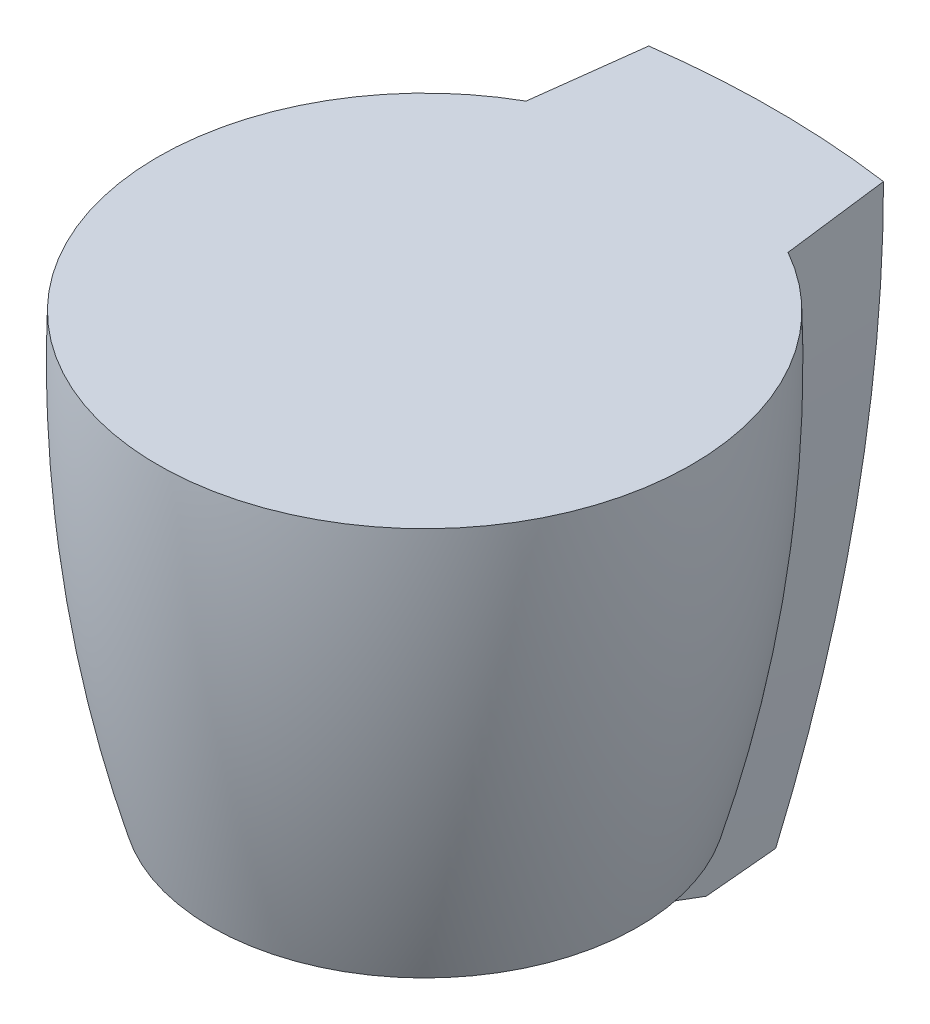
ISO-10303-21;
HEADER;
FILE_DESCRIPTION(('STEP AP214'),'2;1');
FILE_NAME('part.step','',(''),(''),'','','');
FILE_SCHEMA(('AUTOMOTIVE_DESIGN { 1 0 10303 214 1 1 1 1 }'));
ENDSEC;
DATA;
#1=APPLICATION_CONTEXT('core data for automotive mechanical design processes');
#2=APPLICATION_PROTOCOL_DEFINITION('international standard','automotive_design',2000,#1);
#3=PRODUCT_CONTEXT('',#1,'mechanical');
#4=PRODUCT('Part','Part','',(#3));
#5=PRODUCT_RELATED_PRODUCT_CATEGORY('part','',(#4));
#6=PRODUCT_DEFINITION_FORMATION('','',#4);
#7=PRODUCT_DEFINITION_CONTEXT('part definition',#1,'design');
#8=PRODUCT_DEFINITION('design','',#6,#7);
#9=PRODUCT_DEFINITION_SHAPE('','',#8);
#10=(LENGTH_UNIT() NAMED_UNIT(*) SI_UNIT(.MILLI.,.METRE.));
#11=(NAMED_UNIT(*) PLANE_ANGLE_UNIT() SI_UNIT($,.RADIAN.));
#12=(NAMED_UNIT(*) SI_UNIT($,.STERADIAN.) SOLID_ANGLE_UNIT());
#13=UNCERTAINTY_MEASURE_WITH_UNIT(LENGTH_MEASURE(1.E-05),#10,'distance_accuracy_value','');
#14=(GEOMETRIC_REPRESENTATION_CONTEXT(3) GLOBAL_UNCERTAINTY_ASSIGNED_CONTEXT((#13)) GLOBAL_UNIT_ASSIGNED_CONTEXT((#10,
#11,#12)) REPRESENTATION_CONTEXT('',''));
#15=CARTESIAN_POINT('',(0.,0.,0.));
#16=DIRECTION('',(0.,0.,1.));
#17=DIRECTION('',(1.,0.,0.));
#18=AXIS2_PLACEMENT_3D('',#15,#16,#17);
#19=CARTESIAN_POINT('',(0.,-18.72,51.3187337422066));
#20=DIRECTION('',(0.,-0.909364613342745,0.416));
#21=DIRECTION('',(0.,-0.416,-0.909364613342745));
#22=AXIS2_PLACEMENT_3D('',#19,#20,#21);
#23=PLANE('',#22);
#24=DIRECTION('',(-0.124034734589208,0.412787596712886,0.902342387686284));
#25=VECTOR('',#24,1.);
#26=CARTESIAN_POINT('',(-11.,-51.6838987985341,-20.7394467510587));
#27=LINE('',#26,#25);
#28=CARTESIAN_POINT('',(-11.6564132246069,-49.4993555870424,-15.9640950855572));
#29=VERTEX_POINT('',#28);
#30=CARTESIAN_POINT('',(-14.510786898598,-40.,4.80123621351998));
#31=VERTEX_POINT('',#30);
#32=EDGE_CURVE('E162',#29,#31,#27,.T.);
#33=ORIENTED_EDGE('',*,*,#32,.F.);
#34=CARTESIAN_POINT('',(-1.25296461092218,-0.593647771467167,90.9424435633945));
#35=DIRECTION('',(0.,-0.909364613342745,0.416));
#36=DIRECTION('',(0.,-0.416,-0.909364613342745));
#37=AXIS2_PLACEMENT_3D('',#34,#35,#36);
#38=ELLIPSE('',#37,120.192307692308,50.);
#39=CARTESIAN_POINT('',(11.8528995719685,-48.8454490230228,-14.5346732351917));
#40=VERTEX_POINT('',#39);
#41=EDGE_CURVE('E57',#29,#40,#38,.T.);
#42=ORIENTED_EDGE('',*,*,#41,.T.);
#43=DIRECTION('',(-0.124034734589209,-0.412787596712886,-0.902342387686284));
#44=VECTOR('',#43,1.);
#45=CARTESIAN_POINT('',(11.,-51.6838987985341,-20.7394467510587));
#46=LINE('',#45,#44);
#47=CARTESIAN_POINT('',(14.510786898598,-40.,4.80123621351998));
#48=VERTEX_POINT('',#47);
#49=EDGE_CURVE('E105',#48,#40,#46,.T.);
#50=ORIENTED_EDGE('',*,*,#49,.F.);
#51=DIRECTION('',(1.,0.,0.));
#52=VECTOR('',#51,1.);
#53=CARTESIAN_POINT('',(0.,-40.,4.80123621351997));
#54=LINE('',#53,#52);
#55=EDGE_CURVE('E50',#31,#48,#54,.T.);
#56=ORIENTED_EDGE('',*,*,#55,.F.);
#57=EDGE_LOOP('',(#33,#42,#50,#56));
#58=FACE_BOUND('',#57,.T.);
#59=ADVANCED_FACE('F36',(#58),#23,.T.);
#60=CARTESIAN_POINT('',(15.,0.,92.2401413426301));
#61=DIRECTION('',(-1.,0.,0.));
#62=DIRECTION('',(0.,0.,1.));
#63=AXIS2_PLACEMENT_3D('',#60,#61,#62);
#64=CONICAL_SURFACE('',#63,92.2401413426301,1.44644133224814);
#65=CARTESIAN_POINT('',(10.5998,-49.1684557595392,-25.3347726257164));
#66=CARTESIAN_POINT('',(10.9285697063352,-49.088241885023,-22.5171814731237));
#67=CARTESIAN_POINT('',(11.2560494038739,-49.0047876128636,-19.6995320745831));
#68=CARTESIAN_POINT('',(11.9077153235089,-48.8317025079666,-14.0640602120885));
#69=CARTESIAN_POINT('',(12.2319015663898,-48.7420717142359,-11.2462377493396));
#70=CARTESIAN_POINT('',(12.8762714368329,-48.5569367377064,-5.61032630924838));
#71=CARTESIAN_POINT('',(13.1964550625591,-48.4614325522134,-2.79223733178432));
#72=CARTESIAN_POINT('',(13.6729782407121,-48.3141243021799,1.43518637331991));
#73=CARTESIAN_POINT('',(13.8311944311132,-48.2643460552882,2.84438055871287));
#74=CARTESIAN_POINT('',(14.1462158349575,-48.1635186463164,5.66288131510824));
#75=CARTESIAN_POINT('',(14.3030210482408,-48.1124694840922,7.07218788612336));
#76=CARTESIAN_POINT('',(14.4590408233604,-48.0608246965074,8.48155983487198));
#77=B_SPLINE_CURVE_WITH_KNOTS('',3,(#65,#66,#67,#68,#69,#70,#71,#72,#73,#74,#75,#76),
.UNSPECIFIED.,.F.,.F.,(4,2,2,2,2,4),(0.,8.51352189987717,17.0269900387586,25.5404620828377,
29.7972257549273,34.0539899092977),.UNSPECIFIED.);
#78=CARTESIAN_POINT('',(11.,-49.0690524448011,-21.8994259117014));
#79=VERTEX_POINT('',#78);
#80=EDGE_CURVE('E108',#79,#40,#77,.T.);
#81=ORIENTED_EDGE('',*,*,#80,.F.);
#82=CARTESIAN_POINT('',(11.,0.,92.2401413426301));
#83=DIRECTION('',(-1.,0.,0.));
#84=DIRECTION('',(0.,0.,-1.));
#85=AXIS2_PLACEMENT_3D('',#82,#83,#84);
#86=CIRCLE('',#85,124.24014134263);
#87=CARTESIAN_POINT('',(11.,0.,-32.));
#88=VERTEX_POINT('',#87);
#89=EDGE_CURVE('E97',#88,#79,#86,.T.);
#90=ORIENTED_EDGE('',*,*,#89,.F.);
#91=DIRECTION('',(-0.124034734589209,0.,-0.992277876713668));
#92=VECTOR('',#91,1.);
#93=CARTESIAN_POINT('',(11.,0.,-32.));
#94=LINE('',#93,#92);
#95=CARTESIAN_POINT('',(12.2778254245074,0.,-21.7773966039405));
#96=VERTEX_POINT('',#95);
#97=EDGE_CURVE('E168',#96,#88,#94,.T.);
#98=ORIENTED_EDGE('',*,*,#97,.F.);
#99=CARTESIAN_POINT('',(12.1159586355089,-40.0002,-15.9122985666988));
#100=CARTESIAN_POINT('',(12.1166415151511,-39.3711837030805,-16.1391166065586));
#101=CARTESIAN_POINT('',(12.1175813075367,-38.7395138811811,-16.3585222028859));
#102=CARTESIAN_POINT('',(12.1198923587068,-37.4714134381908,-16.7830195530315));
#103=CARTESIAN_POINT('',(12.1212635975419,-36.8349830385493,-16.9881119681329));
#104=CARTESIAN_POINT('',(12.1243549488707,-35.5579783242405,-17.3844748708992));
#105=CARTESIAN_POINT('',(12.1260749908912,-34.9174048719195,-17.5757481400601));
#106=CARTESIAN_POINT('',(12.1298028178331,-33.6324138594705,-17.9449004577609));
#107=CARTESIAN_POINT('',(12.1318106066535,-32.9879962473686,-18.1227793247603));
#108=CARTESIAN_POINT('',(12.1381848175022,-31.0499054362359,-18.6367230288394));
#109=CARTESIAN_POINT('',(12.1429031214767,-29.7509937139515,-18.9532187102451));
#110=CARTESIAN_POINT('',(12.152969286705,-27.1419197933058,-19.5358435904285));
#111=CARTESIAN_POINT('',(12.158317183428,-25.8317569649528,-19.8019699493606));
#112=CARTESIAN_POINT('',(12.1693593067313,-23.2198690979905,-20.2818557298361));
#113=CARTESIAN_POINT('',(12.1750479906828,-21.9182630757302,-20.49626367127));
#114=CARTESIAN_POINT('',(12.1866922027163,-19.3081787641486,-20.8780035507994));
#115=CARTESIAN_POINT('',(12.1926477306819,-17.9997004778273,-21.0453355094442));
#116=CARTESIAN_POINT('',(12.2047254184603,-15.3779378521335,-21.3334091574271));
#117=CARTESIAN_POINT('',(12.2108475404927,-14.0646546599452,-21.4541613174879));
#118=CARTESIAN_POINT('',(12.2231930517684,-11.4347489554589,-21.6494421105332));
#119=CARTESIAN_POINT('',(12.2294164320957,-10.1181267456978,-21.7239747909232));
#120=CARTESIAN_POINT('',(12.239144810413,-8.06891932662882,-21.8040918211288));
#121=CARTESIAN_POINT('',(12.2426282628609,-7.3369201980038,-21.8255977559604));
#122=CARTESIAN_POINT('',(12.249610745283,-5.87276215823027,-21.8544129069715));
#123=CARTESIAN_POINT('',(12.2531097724283,-5.14060329736112,-21.8617246035042));
#124=CARTESIAN_POINT('',(12.2601353780569,-3.67355307142385,-21.8621586832928));
#125=CARTESIAN_POINT('',(12.2636620106235,-2.93866169796816,-21.855228052255));
#126=CARTESIAN_POINT('',(12.2707317179494,-1.46902158506246,-21.8270519020343));
#127=CARTESIAN_POINT('',(12.2742747955467,-0.734272894903672,-21.8058038131993));
#128=CARTESIAN_POINT('',(12.2778263917298,0.000199999999987103,-21.7773888659862));
#129=B_SPLINE_CURVE_WITH_KNOTS('',3,(#99,#100,#101,#102,#103,#104,#105,#106,#107,#108,#109,#110,
#111,#112,#113,#114,#115,#116,#117,#118,#119,#120,#121,#122,#123,#124,#125,#126,#127,#128),
.UNSPECIFIED.,.F.,.F.,(4,2,2,2,2,2,2,2,2,2,2,2,2,2,4),(0.,2.00591158983799,4.01173044314939,
6.01714443711072,8.02258560649914,12.0322112076152,16.042062805972,19.9986617532758,
23.9552589734574,27.9109662669007,31.8663271130534,34.0631795298544,36.2596480260524,
38.4643072569363,40.6693622785321),.UNSPECIFIED.);
#130=CARTESIAN_POINT('',(12.115958851504,-39.9999999999787,-15.9123706941771));
#131=VERTEX_POINT('',#130);
#132=EDGE_CURVE('E137',#131,#96,#129,.T.);
#133=ORIENTED_EDGE('',*,*,#132,.F.);
#134=CARTESIAN_POINT('',(5.83516058770496,-40.,-68.4139436109496));
#135=CARTESIAN_POINT('',(6.36133173395651,-40.,-64.0756950470568));
#136=CARTESIAN_POINT('',(6.88636047728522,-40.,-59.7373073205792));
#137=CARTESIAN_POINT('',(7.9332863525909,-40.,-51.0601572705761));
#138=CARTESIAN_POINT('',(8.45518348680058,-40.,-46.7213949473198));
#139=CARTESIAN_POINT('',(9.49499158417468,-40.,-38.0434642420769));
#140=CARTESIAN_POINT('',(10.0129026124228,-40.,-33.704295867896));
#141=CARTESIAN_POINT('',(11.043456525439,-40.,-25.0253278468546));
#142=CARTESIAN_POINT('',(11.5560994038431,-40.,-20.685528199238));
#143=CARTESIAN_POINT('',(12.5742892227675,-40.,-12.0050098024704));
#144=CARTESIAN_POINT('',(13.0798360262658,-40.,-7.66429103721006));
#145=CARTESIAN_POINT('',(13.8306926696005,-40.,-1.15235815051169));
#146=CARTESIAN_POINT('',(14.0797339609832,-40.,1.01842568594517));
#147=CARTESIAN_POINT('',(14.5748228973091,-40.,5.36033454264405));
#148=CARTESIAN_POINT('',(14.8208705428742,-40.,7.53145956281509));
#149=CARTESIAN_POINT('',(15.3093650203666,-40.,11.8741553911394));
#150=CARTESIAN_POINT('',(15.5518117861553,-40.,14.0457262067398));
#151=CARTESIAN_POINT('',(16.0323125660205,-40.,18.3893521328816));
#152=CARTESIAN_POINT('',(16.2703665843202,-40.,20.5614072429553));
#153=CARTESIAN_POINT('',(16.7410775579723,-40.,24.9061257902533));
#154=CARTESIAN_POINT('',(16.9737344588805,-40.,27.0787892333906));
#155=CARTESIAN_POINT('',(17.3176812616985,-40.,30.3383195589199));
#156=CARTESIAN_POINT('',(17.4314906246859,-40.,31.4249206852587));
#157=CARTESIAN_POINT('',(17.6572199340082,-40.,33.5983198831766));
#158=CARTESIAN_POINT('',(17.7691398790156,-40.,34.6851179548935));
#159=CARTESIAN_POINT('',(17.8800101544006,-40.,35.7720236223514));
#160=B_SPLINE_CURVE_WITH_KNOTS('',3,(#134,#135,#136,#137,#138,#139,#140,#141,#142,#143,#144,
#145,#146,#147,#148,#149,#150,#151,#152,#153,#154,#155,#156,#157,#158,#159),.UNSPECIFIED.,.F.,
.F.,(4,2,2,2,2,2,2,2,2,2,2,2,4),(0.,13.1101231670244,26.2202369860139,39.3301362916838,
52.4400514320797,65.5502193715224,72.1052857365293,78.6603507394322,85.2155359929185,
91.7707149441405,98.3259599930812,101.603593520884,104.881229351546),.UNSPECIFIED.);
#161=EDGE_CURVE('E143',#131,#48,#160,.T.);
#162=ORIENTED_EDGE('',*,*,#161,.T.);
#163=ORIENTED_EDGE('',*,*,#49,.T.);
#164=EDGE_LOOP('',(#81,#90,#98,#133,#162,#163));
#165=FACE_BOUND('',#164,.T.);
#166=ADVANCED_FACE('F109',(#165),#64,.T.);
#167=CARTESIAN_POINT('',(-11.,0.,92.2401413426301));
#168=DIRECTION('',(1.,0.,0.));
#169=DIRECTION('',(0.,0.,-1.));
#170=AXIS2_PLACEMENT_3D('',#167,#168,#169);
#171=CONICAL_SURFACE('',#170,124.24014134263,1.44644133224814);
#172=CARTESIAN_POINT('',(-14.4108208876517,-48.8312971565785,8.48155983487198));
#173=CARTESIAN_POINT('',(-14.2570037274248,-48.873255071167,7.08166382159529));
#174=CARTESIAN_POINT('',(-14.1023728113799,-48.9146424953768,5.68184039354049));
#175=CARTESIAN_POINT('',(-13.7916464972963,-48.9962017921403,2.88232085367854));
#176=CARTESIAN_POINT('',(-13.6355510994645,-49.0363736648656,1.48262474185344));
#177=CARTESIAN_POINT('',(-13.165314668816,-49.1549536110228,-2.71628207526888));
#178=CARTESIAN_POINT('',(-12.8492214254662,-49.2314265515007,-5.51532918357581));
#179=CARTESIAN_POINT('',(-12.212856157823,-49.3787624564531,-11.1130937488742));
#180=CARTESIAN_POINT('',(-11.8925841360029,-49.4496254242478,-13.9118112060598));
#181=CARTESIAN_POINT('',(-11.2485932225396,-49.5854423689521,-19.5090106421463));
#182=CARTESIAN_POINT('',(-10.9248743094357,-49.6503963090475,-22.3074926194716));
#183=CARTESIAN_POINT('',(-10.5998,-49.712245758477,-25.1058856804039));
#184=B_SPLINE_CURVE_WITH_KNOTS('',3,(#172,#173,#174,#175,#176,#177,#178,#179,#180,#181,#182,
#183),.UNSPECIFIED.,.F.,.F.,(4,2,2,2,2,4),(0.,4.22683739452573,8.45367419190618,
16.9072936736193,25.3609081522064,33.8145752945198),.UNSPECIFIED.);
#185=CARTESIAN_POINT('',(-11.,-49.634399204577,-21.654718666228));
#186=VERTEX_POINT('',#185);
#187=EDGE_CURVE('E65',#29,#186,#184,.T.);
#188=ORIENTED_EDGE('',*,*,#187,.F.);
#189=ORIENTED_EDGE('',*,*,#32,.T.);
#190=CARTESIAN_POINT('',(-17.8800101544006,-40.,35.7720236223514));
#191=CARTESIAN_POINT('',(-17.7691398790155,-40.,34.6851179548934));
#192=CARTESIAN_POINT('',(-17.6572199340082,-40.,33.5983198831766));
#193=CARTESIAN_POINT('',(-17.4314906246859,-40.,31.4249206852587));
#194=CARTESIAN_POINT('',(-17.3176812616985,-40.,30.3383195589199));
#195=CARTESIAN_POINT('',(-16.9737344588804,-40.,27.0787892333906));
#196=CARTESIAN_POINT('',(-16.7410775579723,-40.,24.9061257902533));
#197=CARTESIAN_POINT('',(-16.2703665843202,-40.,20.5614072429553));
#198=CARTESIAN_POINT('',(-16.0323125660205,-40.,18.3893521328816));
#199=CARTESIAN_POINT('',(-15.5518117861552,-40.,14.0457262067398));
#200=CARTESIAN_POINT('',(-15.3093650203666,-40.,11.8741553911394));
#201=CARTESIAN_POINT('',(-14.8208705428742,-40.,7.53145956281508));
#202=CARTESIAN_POINT('',(-14.574822897309,-40.,5.36033454264404));
#203=CARTESIAN_POINT('',(-14.0797339609832,-40.,1.01842568594516));
#204=CARTESIAN_POINT('',(-13.8306926696005,-40.,-1.1523581505117));
#205=CARTESIAN_POINT('',(-13.0798360262658,-40.,-7.66429103721007));
#206=CARTESIAN_POINT('',(-12.5742892227675,-40.,-12.0050098024704));
#207=CARTESIAN_POINT('',(-11.5560994038431,-40.,-20.685528199238));
#208=CARTESIAN_POINT('',(-11.043456525439,-40.,-25.0253278468546));
#209=CARTESIAN_POINT('',(-10.0129026124228,-40.,-33.704295867896));
#210=CARTESIAN_POINT('',(-9.49499158417468,-40.,-38.0434642420769));
#211=CARTESIAN_POINT('',(-8.45518348680058,-40.,-46.7213949473198));
#212=CARTESIAN_POINT('',(-7.93328635259091,-40.,-51.0601572705761));
#213=CARTESIAN_POINT('',(-6.88636047728523,-40.,-59.7373073205792));
#214=CARTESIAN_POINT('',(-6.36133173395652,-40.,-64.0756950470568));
#215=CARTESIAN_POINT('',(-5.83516058770496,-40.,-68.4139436109496));
#216=B_SPLINE_CURVE_WITH_KNOTS('',3,(#190,#191,#192,#193,#194,#195,#196,#197,#198,#199,#200,
#201,#202,#203,#204,#205,#206,#207,#208,#209,#210,#211,#212,#213,#214,#215),.UNSPECIFIED.,.F.,
.F.,(4,2,2,2,2,2,2,2,2,2,2,2,4),(0.,3.27763583066179,6.55526935846439,13.1105144074051,
19.6656933586271,26.2208786121134,32.7759436150163,39.3310099800232,52.4411779194659,
65.5510930598618,78.6609923655317,91.7711061845212,104.881229351546),.UNSPECIFIED.);
#217=CARTESIAN_POINT('',(-12.115958851504,-40.,-15.9123706941695));
#218=VERTEX_POINT('',#217);
#219=EDGE_CURVE('E161',#31,#218,#216,.T.);
#220=ORIENTED_EDGE('',*,*,#219,.T.);
#221=CARTESIAN_POINT('',(-12.2778263917298,0.000199999999986122,-21.7773888659862));
#222=CARTESIAN_POINT('',(-12.2737149462805,-0.850065309911752,-21.8102817789498));
#223=CARTESIAN_POINT('',(-12.2696149697004,-1.70067135778829,-21.8335717473764));
#224=CARTESIAN_POINT('',(-12.2614359374706,-3.40219323891588,-21.8609683113304));
#225=CARTESIAN_POINT('',(-12.2573568818381,-4.25310907242194,-21.8650748910304));
#226=CARTESIAN_POINT('',(-12.2451487525478,-6.80562126031076,-21.8486541666244));
#227=CARTESIAN_POINT('',(-12.2370480390015,-8.50712267143202,-21.7993918168326));
#228=CARTESIAN_POINT('',(-12.221037971167,-11.8911298225781,-21.6248841357711));
#229=CARTESIAN_POINT('',(-12.2131275596756,-13.5736708338783,-21.5003121548106));
#230=CARTESIAN_POINT('',(-12.1975333343812,-16.9315169110307,-21.1752536382781));
#231=CARTESIAN_POINT('',(-12.189849530198,-18.6068216671254,-20.9747638848891));
#232=CARTESIAN_POINT('',(-12.1748963865301,-21.9470426486089,-20.4968082996524));
#233=CARTESIAN_POINT('',(-12.1676271999492,-23.6119548423923,-20.2193142884388));
#234=CARTESIAN_POINT('',(-12.1538061747275,-26.9267087812526,-19.5857280260656));
#235=CARTESIAN_POINT('',(-12.1472542586082,-28.5765521363634,-19.2296442766177));
#236=CARTESIAN_POINT('',(-12.1383009712885,-31.0437038183901,-18.6327099700252));
#237=CARTESIAN_POINT('',(-12.1354516924973,-31.8684429729198,-18.4221931566277));
#238=CARTESIAN_POINT('',(-12.1301493576327,-33.5121984836918,-17.9798825651021));
#239=CARTESIAN_POINT('',(-12.1276962921346,-34.3312149756155,-17.7480892932827));
#240=CARTESIAN_POINT('',(-12.1232969321527,-35.9630109280138,-17.2624475941085));
#241=CARTESIAN_POINT('',(-12.1213508132636,-36.7757881329833,-17.0085915652124));
#242=CARTESIAN_POINT('',(-12.1189237649432,-37.9893346639083,-16.6106181256937));
#243=CARTESIAN_POINT('',(-12.1181967464284,-38.3929336939445,-16.4750881973564));
#244=CARTESIAN_POINT('',(-12.1169307081162,-39.1981150765214,-16.1981445607131));
#245=CARTESIAN_POINT('',(-12.1163916913494,-39.599697396449,-16.0567307575974));
#246=CARTESIAN_POINT('',(-12.1159586355088,-40.0002,-15.9122985666988));
#247=B_SPLINE_CURVE_WITH_KNOTS('',3,(#221,#222,#223,#224,#225,#226,#227,#228,#229,#230,#231,
#232,#233,#234,#235,#236,#237,#238,#239,#240,#241,#242,#243,#244,#245,#246),.UNSPECIFIED.,.F.,
.F.,(4,2,2,2,2,2,2,2,2,2,2,2,4),(0.,2.55261831933324,5.10523874470143,10.2100585552834,
15.2698971521547,20.329950237109,25.3918574734616,30.4532173889833,33.0065452716697,
35.5598124094005,38.1139627684439,39.3911658427754,40.6683895052593),.UNSPECIFIED.);
#248=CARTESIAN_POINT('',(-12.2778254245074,0.,-21.7773966039405));
#249=VERTEX_POINT('',#248);
#250=EDGE_CURVE('E173',#249,#218,#247,.T.);
#251=ORIENTED_EDGE('',*,*,#250,.F.);
#252=DIRECTION('',(-0.124034734589208,0.,0.992277876713668));
#253=VECTOR('',#252,1.);
#254=CARTESIAN_POINT('',(-11.,0.,-32.));
#255=LINE('',#254,#253);
#256=CARTESIAN_POINT('',(-11.,0.,-32.));
#257=VERTEX_POINT('',#256);
#258=EDGE_CURVE('E163',#257,#249,#255,.T.);
#259=ORIENTED_EDGE('',*,*,#258,.F.);
#260=CARTESIAN_POINT('',(-11.,0.,92.2401413426301));
#261=DIRECTION('',(-1.,0.,0.));
#262=DIRECTION('',(0.,0.,-1.));
#263=AXIS2_PLACEMENT_3D('',#260,#261,#262);
#264=CIRCLE('',#263,124.24014134263);
#265=EDGE_CURVE('E104',#257,#186,#264,.T.);
#266=ORIENTED_EDGE('',*,*,#265,.T.);
#267=EDGE_LOOP('',(#188,#189,#220,#251,#259,#266));
#268=FACE_BOUND('',#267,.T.);
#269=ADVANCED_FACE('F123',(#268),#171,.T.);
#270=CARTESIAN_POINT('',(0.,0.,92.2401413426301));
#271=DIRECTION('',(-1.,0.,0.));
#272=DIRECTION('',(0.,0.,1.));
#273=AXIS2_PLACEMENT_3D('',#270,#271,#272);
#274=DEGENERATE_TOROIDAL_SURFACE('',#273,45.,80.,.T.);
#275=CARTESIAN_POINT('',(-11.0002,-49.6343594533943,-21.6547057036312));
#276=CARTESIAN_POINT('',(-10.323679798211,-49.7688331418661,-21.698559126222));
#277=CARTESIAN_POINT('',(-9.64417339022802,-49.8893286374582,-21.7391560829787));
#278=CARTESIAN_POINT('',(-8.28038819816201,-50.1021458451146,-21.813714345262));
#279=CARTESIAN_POINT('',(-7.59610932294341,-50.1944670176436,-21.8476755237097));
#280=CARTESIAN_POINT('',(-6.22368130345066,-50.3507499016959,-21.9088522602927));
#281=CARTESIAN_POINT('',(-5.53553048431757,-50.4146982022363,-21.9360646257976));
#282=CARTESIAN_POINT('',(-4.15698751732061,-50.5140277580799,-21.9836412873436));
#283=CARTESIAN_POINT('',(-3.4665954103776,-50.5494095320311,-22.0040057077105));
#284=CARTESIAN_POINT('',(-1.41991501830399,-50.6117542494765,-22.0541031405151));
#285=CARTESIAN_POINT('',(-0.0619215187507129,-50.5978781604112,-22.0740040626714));
#286=CARTESIAN_POINT('',(2.64782872082794,-50.4596992614802,-22.0871738305926));
#287=CARTESIAN_POINT('',(3.99958862629759,-50.3354606211611,-22.0804581445476));
#288=CARTESIAN_POINT('',(5.81818877231413,-50.0934296111575,-22.0537253698538));
#289=CARTESIAN_POINT('',(6.29192052420229,-50.0234368869183,-22.0451202575723));
#290=CARTESIAN_POINT('',(7.23704864036247,-49.8698971429272,-22.0246967198476));
#291=CARTESIAN_POINT('',(7.70844542744565,-49.7863526770163,-22.0128788995596));
#292=CARTESIAN_POINT('',(8.65173212174903,-49.6051689766391,-21.985980274626));
#293=CARTESIAN_POINT('',(9.12360378693094,-49.507438204767,-21.9708779344079));
#294=CARTESIAN_POINT('',(10.0643062448771,-49.298387026244,-21.9375082094271));
#295=CARTESIAN_POINT('',(10.5331364594918,-49.1870641112227,-21.9192402401999));
#296=CARTESIAN_POINT('',(11.0002,-49.0690018910365,-21.8994174240721));
#297=B_SPLINE_CURVE_WITH_KNOTS('',3,(#275,#276,#277,#278,#279,#280,#281,#282,#283,#284,#285,
#286,#287,#288,#289,#290,#291,#292,#293,#294,#295,#296),.UNSPECIFIED.,.F.,.F.,(4,2,2,2,2,2,2,2,
2,2,4),(0.,2.07328223740526,4.14660417545272,6.22090506763238,8.29516829839604,12.364771534179,
16.4320100748409,17.8687214472255,19.305162383624,20.751321920794,22.1977487448895),.UNSPECIFIED.);
#298=EDGE_CURVE('E12',#186,#79,#297,.T.);
#299=ORIENTED_EDGE('',*,*,#298,.F.);
#300=ORIENTED_EDGE('',*,*,#265,.F.);
#301=CARTESIAN_POINT('',(0.,0.,47.2401413426301));
#302=DIRECTION('',(0.,1.,0.));
#303=DIRECTION('',(0.,0.,-1.));
#304=AXIS2_PLACEMENT_3D('',#301,#302,#303);
#305=CIRCLE('',#304,80.);
#306=EDGE_CURVE('E102',#88,#257,#305,.T.);
#307=ORIENTED_EDGE('',*,*,#306,.F.);
#308=ORIENTED_EDGE('',*,*,#89,.T.);
#309=EDGE_LOOP('',(#299,#300,#307,#308));
#310=FACE_BOUND('',#309,.T.);
#311=ADVANCED_FACE('F99',(#310),#274,.T.);
#312=CARTESIAN_POINT('',(0.,-40.,0.));
#313=DIRECTION('',(0.,1.,0.));
#314=DIRECTION('',(0.,0.,1.));
#315=AXIS2_PLACEMENT_3D('',#312,#313,#314);
#316=PLANE('',#315);
#317=ORIENTED_EDGE('',*,*,#161,.F.);
#318=CARTESIAN_POINT('',(0.,-40.,0.));
#319=DIRECTION('',(0.,1.,0.));
#320=DIRECTION('',(0.,0.,1.));
#321=AXIS2_PLACEMENT_3D('',#318,#319,#320);
#322=CIRCLE('',#321,20.);
#323=EDGE_CURVE('E148',#218,#131,#322,.T.);
#324=ORIENTED_EDGE('',*,*,#323,.F.);
#325=ORIENTED_EDGE('',*,*,#219,.F.);
#326=ORIENTED_EDGE('',*,*,#55,.T.);
#327=EDGE_LOOP('',(#317,#324,#325,#326));
#328=FACE_BOUND('',#327,.T.);
#329=ADVANCED_FACE('F38',(#328),#316,.F.);
#330=CARTESIAN_POINT('',(0.,-4.07046767792601,0.));
#331=DIRECTION('',(0.,1.,0.));
#332=DIRECTION('',(0.,0.,1.));
#333=AXIS2_PLACEMENT_3D('',#330,#331,#332);
#334=DEGENERATE_TOROIDAL_SURFACE('',#333,104.936258576592,130.,.F.);
#335=ORIENTED_EDGE('',*,*,#323,.T.);
#336=ORIENTED_EDGE('',*,*,#132,.T.);
#337=CARTESIAN_POINT('',(0.,0.,0.));
#338=DIRECTION('',(0.,-1.,0.));
#339=DIRECTION('',(0.,0.,-1.));
#340=AXIS2_PLACEMENT_3D('',#337,#338,#339);
#341=CIRCLE('',#340,25.);
#342=EDGE_CURVE('E149',#249,#96,#341,.F.);
#343=ORIENTED_EDGE('',*,*,#342,.F.);
#344=ORIENTED_EDGE('',*,*,#250,.T.);
#345=EDGE_LOOP('',(#335,#336,#343,#344));
#346=FACE_BOUND('',#345,.T.);
#347=ADVANCED_FACE('F181',(#346),#334,.F.);
#348=CARTESIAN_POINT('',(0.,0.,0.));
#349=DIRECTION('',(0.,-1.,0.));
#350=DIRECTION('',(0.,0.,-1.));
#351=AXIS2_PLACEMENT_3D('',#348,#349,#350);
#352=PLANE('',#351);
#353=ORIENTED_EDGE('',*,*,#342,.T.);
#354=ORIENTED_EDGE('',*,*,#97,.T.);
#355=ORIENTED_EDGE('',*,*,#306,.T.);
#356=ORIENTED_EDGE('',*,*,#258,.T.);
#357=EDGE_LOOP('',(#353,#354,#355,#356));
#358=FACE_BOUND('',#357,.T.);
#359=ADVANCED_FACE('F128',(#358),#352,.F.);
#360=CARTESIAN_POINT('',(-1.25296461092218,-0.593647771467167,135.543049690804));
#361=DIRECTION('',(0.,0.,-1.));
#362=DIRECTION('',(-1.,0.,0.));
#363=AXIS2_PLACEMENT_3D('',#360,#361,#362);
#364=CYLINDRICAL_SURFACE('',#363,50.);
#365=ORIENTED_EDGE('',*,*,#41,.F.);
#366=ORIENTED_EDGE('',*,*,#187,.T.);
#367=ORIENTED_EDGE('',*,*,#298,.T.);
#368=ORIENTED_EDGE('',*,*,#80,.T.);
#369=EDGE_LOOP('',(#365,#366,#367,#368));
#370=FACE_BOUND('',#369,.T.);
#371=ADVANCED_FACE('F112',(#370),#364,.T.);
#372=CLOSED_SHELL('',(#59,#166,#269,#311,#329,#347,#359,#371));
#373=MANIFOLD_SOLID_BREP('B2',#372);
#374=ADVANCED_BREP_SHAPE_REPRESENTATION('',(#18,#373),#14);
#375=SHAPE_DEFINITION_REPRESENTATION(#9,#374);
ENDSEC;
END-ISO-10303-21;
